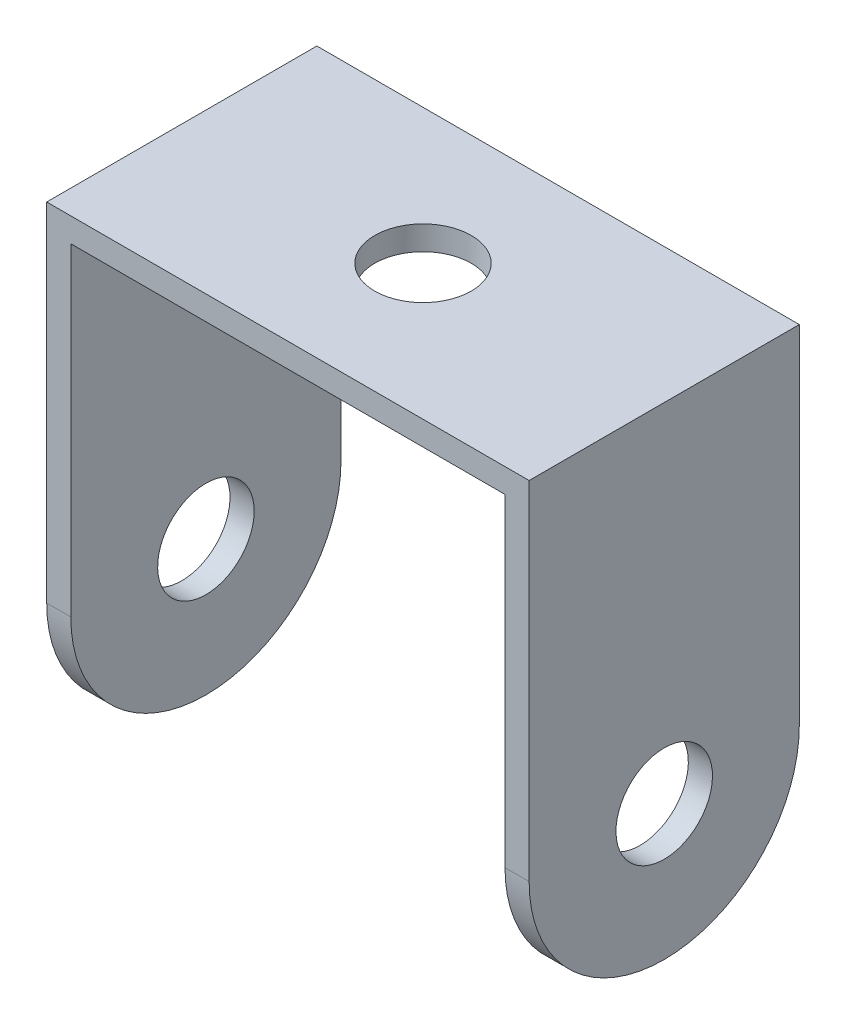
ISO-10303-21;
HEADER;
FILE_DESCRIPTION(('STEP AP214'),'2;1');
FILE_NAME('part.step','',(''),(''),'','','');
FILE_SCHEMA(('AUTOMOTIVE_DESIGN { 1 0 10303 214 1 1 1 1 }'));
ENDSEC;
DATA;
#1=APPLICATION_CONTEXT('core data for automotive mechanical design processes');
#2=APPLICATION_PROTOCOL_DEFINITION('international standard','automotive_design',2000,#1);
#3=PRODUCT_CONTEXT('',#1,'mechanical');
#4=PRODUCT('Part','Part','',(#3));
#5=PRODUCT_RELATED_PRODUCT_CATEGORY('part','',(#4));
#6=PRODUCT_DEFINITION_FORMATION('','',#4);
#7=PRODUCT_DEFINITION_CONTEXT('part definition',#1,'design');
#8=PRODUCT_DEFINITION('design','',#6,#7);
#9=PRODUCT_DEFINITION_SHAPE('','',#8);
#10=(LENGTH_UNIT() NAMED_UNIT(*) SI_UNIT(.MILLI.,.METRE.));
#11=(NAMED_UNIT(*) PLANE_ANGLE_UNIT() SI_UNIT($,.RADIAN.));
#12=(NAMED_UNIT(*) SI_UNIT($,.STERADIAN.) SOLID_ANGLE_UNIT());
#13=UNCERTAINTY_MEASURE_WITH_UNIT(LENGTH_MEASURE(1.E-05),#10,'distance_accuracy_value','');
#14=(GEOMETRIC_REPRESENTATION_CONTEXT(3) GLOBAL_UNCERTAINTY_ASSIGNED_CONTEXT((#13)) GLOBAL_UNIT_ASSIGNED_CONTEXT((#10,
#11,#12)) REPRESENTATION_CONTEXT('',''));
#15=CARTESIAN_POINT('',(0.,0.,0.));
#16=DIRECTION('',(0.,0.,1.));
#17=DIRECTION('',(1.,0.,0.));
#18=AXIS2_PLACEMENT_3D('',#15,#16,#17);
#19=CARTESIAN_POINT('',(0.,0.,28.));
#20=DIRECTION('',(0.,0.,1.));
#21=DIRECTION('',(1.,0.,0.));
#22=AXIS2_PLACEMENT_3D('',#19,#20,#21);
#23=PLANE('',#22);
#24=DIRECTION('',(0.,1.,0.));
#25=VECTOR('',#24,1.);
#26=CARTESIAN_POINT('',(22.5,0.,28.));
#27=LINE('',#26,#25);
#28=CARTESIAN_POINT('',(22.5,-11.,28.));
#29=VERTEX_POINT('',#28);
#30=CARTESIAN_POINT('',(22.5,22.5,28.));
#31=VERTEX_POINT('',#30);
#32=EDGE_CURVE('E132',#29,#31,#27,.T.);
#33=ORIENTED_EDGE('',*,*,#32,.F.);
#34=DIRECTION('',(1.,0.,0.));
#35=VECTOR('',#34,1.);
#36=CARTESIAN_POINT('',(25.,-11.,28.));
#37=LINE('',#36,#35);
#38=CARTESIAN_POINT('',(25.,-11.,28.));
#39=VERTEX_POINT('',#38);
#40=EDGE_CURVE('E201',#29,#39,#37,.T.);
#41=ORIENTED_EDGE('',*,*,#40,.T.);
#42=DIRECTION('',(0.,1.,0.));
#43=VECTOR('',#42,1.);
#44=CARTESIAN_POINT('',(25.,25.,28.));
#45=LINE('',#44,#43);
#46=CARTESIAN_POINT('',(25.,25.,28.));
#47=VERTEX_POINT('',#46);
#48=EDGE_CURVE('E165',#39,#47,#45,.T.);
#49=ORIENTED_EDGE('',*,*,#48,.T.);
#50=DIRECTION('',(-1.,0.,0.));
#51=VECTOR('',#50,1.);
#52=CARTESIAN_POINT('',(-25.,25.,28.));
#53=LINE('',#52,#51);
#54=CARTESIAN_POINT('',(-25.,25.,28.));
#55=VERTEX_POINT('',#54);
#56=EDGE_CURVE('E168',#47,#55,#53,.T.);
#57=ORIENTED_EDGE('',*,*,#56,.T.);
#58=DIRECTION('',(0.,-1.,0.));
#59=VECTOR('',#58,1.);
#60=CARTESIAN_POINT('',(-25.,25.,28.));
#61=LINE('',#60,#59);
#62=CARTESIAN_POINT('',(-25.,-11.,28.));
#63=VERTEX_POINT('',#62);
#64=EDGE_CURVE('E172',#55,#63,#61,.T.);
#65=ORIENTED_EDGE('',*,*,#64,.T.);
#66=DIRECTION('',(1.,0.,0.));
#67=VECTOR('',#66,1.);
#68=CARTESIAN_POINT('',(-22.5,-11.,28.));
#69=LINE('',#68,#67);
#70=CARTESIAN_POINT('',(-22.5,-11.,28.));
#71=VERTEX_POINT('',#70);
#72=EDGE_CURVE('E144',#63,#71,#69,.T.);
#73=ORIENTED_EDGE('',*,*,#72,.T.);
#74=DIRECTION('',(0.,-1.,0.));
#75=VECTOR('',#74,1.);
#76=CARTESIAN_POINT('',(-22.5,0.,28.));
#77=LINE('',#76,#75);
#78=CARTESIAN_POINT('',(-22.5,22.5,28.));
#79=VERTEX_POINT('',#78);
#80=EDGE_CURVE('E133',#79,#71,#77,.T.);
#81=ORIENTED_EDGE('',*,*,#80,.F.);
#82=DIRECTION('',(-1.,0.,0.));
#83=VECTOR('',#82,1.);
#84=CARTESIAN_POINT('',(0.,22.5,28.));
#85=LINE('',#84,#83);
#86=EDGE_CURVE('E120',#31,#79,#85,.T.);
#87=ORIENTED_EDGE('',*,*,#86,.F.);
#88=EDGE_LOOP('',(#33,#41,#49,#57,#65,#73,#81,#87));
#89=FACE_BOUND('',#88,.T.);
#90=ADVANCED_FACE('F39',(#89),#23,.T.);
#91=CARTESIAN_POINT('',(0.,0.,0.));
#92=DIRECTION('',(0.,0.,1.));
#93=DIRECTION('',(1.,0.,0.));
#94=AXIS2_PLACEMENT_3D('',#91,#92,#93);
#95=PLANE('',#94);
#96=DIRECTION('',(0.,-1.,0.));
#97=VECTOR('',#96,1.);
#98=CARTESIAN_POINT('',(-22.5,0.,0.));
#99=LINE('',#98,#97);
#100=CARTESIAN_POINT('',(-22.5,22.5,0.));
#101=VERTEX_POINT('',#100);
#102=CARTESIAN_POINT('',(-22.5,-11.,0.));
#103=VERTEX_POINT('',#102);
#104=EDGE_CURVE('E138',#101,#103,#99,.T.);
#105=ORIENTED_EDGE('',*,*,#104,.T.);
#106=DIRECTION('',(1.,0.,0.));
#107=VECTOR('',#106,1.);
#108=CARTESIAN_POINT('',(0.,-11.,0.));
#109=LINE('',#108,#107);
#110=CARTESIAN_POINT('',(-25.,-11.,0.));
#111=VERTEX_POINT('',#110);
#112=EDGE_CURVE('E11',#103,#111,#109,.F.);
#113=ORIENTED_EDGE('',*,*,#112,.T.);
#114=DIRECTION('',(0.,-1.,0.));
#115=VECTOR('',#114,1.);
#116=CARTESIAN_POINT('',(-25.,25.,0.));
#117=LINE('',#116,#115);
#118=CARTESIAN_POINT('',(-25.,25.,0.));
#119=VERTEX_POINT('',#118);
#120=EDGE_CURVE('E169',#119,#111,#117,.T.);
#121=ORIENTED_EDGE('',*,*,#120,.F.);
#122=DIRECTION('',(-1.,0.,0.));
#123=VECTOR('',#122,1.);
#124=CARTESIAN_POINT('',(-25.,25.,0.));
#125=LINE('',#124,#123);
#126=CARTESIAN_POINT('',(25.,25.,0.));
#127=VERTEX_POINT('',#126);
#128=EDGE_CURVE('E178',#127,#119,#125,.T.);
#129=ORIENTED_EDGE('',*,*,#128,.F.);
#130=DIRECTION('',(0.,1.,0.));
#131=VECTOR('',#130,1.);
#132=CARTESIAN_POINT('',(25.,25.,0.));
#133=LINE('',#132,#131);
#134=CARTESIAN_POINT('',(25.,-11.,0.));
#135=VERTEX_POINT('',#134);
#136=EDGE_CURVE('E163',#135,#127,#133,.T.);
#137=ORIENTED_EDGE('',*,*,#136,.F.);
#138=DIRECTION('',(1.,0.,0.));
#139=VECTOR('',#138,1.);
#140=CARTESIAN_POINT('',(0.,-11.,0.));
#141=LINE('',#140,#139);
#142=CARTESIAN_POINT('',(22.5,-11.,0.));
#143=VERTEX_POINT('',#142);
#144=EDGE_CURVE('E49',#135,#143,#141,.F.);
#145=ORIENTED_EDGE('',*,*,#144,.T.);
#146=DIRECTION('',(0.,1.,0.));
#147=VECTOR('',#146,1.);
#148=CARTESIAN_POINT('',(22.5,0.,0.));
#149=LINE('',#148,#147);
#150=CARTESIAN_POINT('',(22.5,22.5,0.));
#151=VERTEX_POINT('',#150);
#152=EDGE_CURVE('E146',#143,#151,#149,.T.);
#153=ORIENTED_EDGE('',*,*,#152,.T.);
#154=DIRECTION('',(-1.,0.,0.));
#155=VECTOR('',#154,1.);
#156=CARTESIAN_POINT('',(0.,22.5,0.));
#157=LINE('',#156,#155);
#158=EDGE_CURVE('E149',#151,#101,#157,.T.);
#159=ORIENTED_EDGE('',*,*,#158,.T.);
#160=EDGE_LOOP('',(#105,#113,#121,#129,#137,#145,#153,#159));
#161=FACE_BOUND('',#160,.T.);
#162=ADVANCED_FACE('F246',(#161),#95,.F.);
#163=CARTESIAN_POINT('',(25.,25.,28.));
#164=DIRECTION('',(-1.,0.,0.));
#165=DIRECTION('',(0.,-1.,0.));
#166=AXIS2_PLACEMENT_3D('',#163,#164,#165);
#167=PLANE('',#166);
#168=CARTESIAN_POINT('',(25.,-11.,14.));
#169=DIRECTION('',(1.,0.,0.));
#170=DIRECTION('',(0.,1.,0.));
#171=AXIS2_PLACEMENT_3D('',#168,#169,#170);
#172=CIRCLE('',#171,5.);
#173=CARTESIAN_POINT('',(25.,-5.99999999999999,14.));
#174=VERTEX_POINT('',#173);
#175=EDGE_CURVE('E232',#174,#174,#172,.T.);
#176=ORIENTED_EDGE('',*,*,#175,.F.);
#177=EDGE_LOOP('',(#176));
#178=FACE_BOUND('',#177,.T.);
#179=ORIENTED_EDGE('',*,*,#48,.F.);
#180=CARTESIAN_POINT('',(25.,-11.,14.));
#181=DIRECTION('',(-1.,0.,0.));
#182=DIRECTION('',(0.,-1.,0.));
#183=AXIS2_PLACEMENT_3D('',#180,#181,#182);
#184=CIRCLE('',#183,14.);
#185=CARTESIAN_POINT('',(25.,-25.,14.));
#186=VERTEX_POINT('',#185);
#187=EDGE_CURVE('E208',#39,#186,#184,.F.);
#188=ORIENTED_EDGE('',*,*,#187,.T.);
#189=CARTESIAN_POINT('',(25.,-11.,14.));
#190=DIRECTION('',(-1.,0.,0.));
#191=DIRECTION('',(0.,-1.,0.));
#192=AXIS2_PLACEMENT_3D('',#189,#190,#191);
#193=CIRCLE('',#192,14.);
#194=EDGE_CURVE('E205',#186,#135,#193,.F.);
#195=ORIENTED_EDGE('',*,*,#194,.T.);
#196=ORIENTED_EDGE('',*,*,#136,.T.);
#197=DIRECTION('',(0.,0.,-1.));
#198=VECTOR('',#197,1.);
#199=CARTESIAN_POINT('',(25.,25.,28.));
#200=LINE('',#199,#198);
#201=EDGE_CURVE('E186',#47,#127,#200,.T.);
#202=ORIENTED_EDGE('',*,*,#201,.F.);
#203=EDGE_LOOP('',(#179,#188,#195,#196,#202));
#204=FACE_BOUND('',#203,.T.);
#205=ADVANCED_FACE('F258',(#178,#204),#167,.F.);
#206=CARTESIAN_POINT('',(-25.,25.,28.));
#207=DIRECTION('',(0.,-1.,0.));
#208=DIRECTION('',(0.,0.,-1.));
#209=AXIS2_PLACEMENT_3D('',#206,#207,#208);
#210=PLANE('',#209);
#211=CARTESIAN_POINT('',(0.,25.,14.));
#212=DIRECTION('',(0.,1.,0.));
#213=DIRECTION('',(0.,0.,1.));
#214=AXIS2_PLACEMENT_3D('',#211,#212,#213);
#215=CIRCLE('',#214,5.);
#216=CARTESIAN_POINT('',(0.,25.,19.));
#217=VERTEX_POINT('',#216);
#218=EDGE_CURVE('E152',#217,#217,#215,.T.);
#219=ORIENTED_EDGE('',*,*,#218,.F.);
#220=EDGE_LOOP('',(#219));
#221=FACE_BOUND('',#220,.T.);
#222=ORIENTED_EDGE('',*,*,#128,.T.);
#223=DIRECTION('',(0.,0.,-1.));
#224=VECTOR('',#223,1.);
#225=CARTESIAN_POINT('',(-25.,25.,28.));
#226=LINE('',#225,#224);
#227=EDGE_CURVE('E175',#55,#119,#226,.T.);
#228=ORIENTED_EDGE('',*,*,#227,.F.);
#229=ORIENTED_EDGE('',*,*,#56,.F.);
#230=ORIENTED_EDGE('',*,*,#201,.T.);
#231=EDGE_LOOP('',(#222,#228,#229,#230));
#232=FACE_BOUND('',#231,.T.);
#233=ADVANCED_FACE('F285',(#221,#232),#210,.F.);
#234=CARTESIAN_POINT('',(-25.,25.,28.));
#235=DIRECTION('',(1.,0.,0.));
#236=DIRECTION('',(0.,1.,0.));
#237=AXIS2_PLACEMENT_3D('',#234,#235,#236);
#238=PLANE('',#237);
#239=CARTESIAN_POINT('',(-25.,-11.,14.));
#240=DIRECTION('',(1.,0.,0.));
#241=DIRECTION('',(0.,1.,0.));
#242=AXIS2_PLACEMENT_3D('',#239,#240,#241);
#243=CIRCLE('',#242,5.);
#244=CARTESIAN_POINT('',(-25.,-6.,14.));
#245=VERTEX_POINT('',#244);
#246=EDGE_CURVE('E198',#245,#245,#243,.T.);
#247=ORIENTED_EDGE('',*,*,#246,.T.);
#248=EDGE_LOOP('',(#247));
#249=FACE_BOUND('',#248,.T.);
#250=CARTESIAN_POINT('',(-25.,-11.,14.));
#251=DIRECTION('',(1.,0.,0.));
#252=DIRECTION('',(0.,1.,0.));
#253=AXIS2_PLACEMENT_3D('',#250,#251,#252);
#254=CIRCLE('',#253,14.);
#255=CARTESIAN_POINT('',(-25.,-25.,14.));
#256=VERTEX_POINT('',#255);
#257=EDGE_CURVE('E57',#111,#256,#254,.F.);
#258=ORIENTED_EDGE('',*,*,#257,.T.);
#259=CARTESIAN_POINT('',(-25.,-11.,14.));
#260=DIRECTION('',(1.,0.,0.));
#261=DIRECTION('',(0.,1.,0.));
#262=AXIS2_PLACEMENT_3D('',#259,#260,#261);
#263=CIRCLE('',#262,14.);
#264=EDGE_CURVE('E225',#256,#63,#263,.F.);
#265=ORIENTED_EDGE('',*,*,#264,.T.);
#266=ORIENTED_EDGE('',*,*,#64,.F.);
#267=ORIENTED_EDGE('',*,*,#227,.T.);
#268=ORIENTED_EDGE('',*,*,#120,.T.);
#269=EDGE_LOOP('',(#258,#265,#266,#267,#268));
#270=FACE_BOUND('',#269,.T.);
#271=ADVANCED_FACE('F282',(#249,#270),#238,.F.);
#272=CARTESIAN_POINT('',(-22.5,0.,28.));
#273=DIRECTION('',(1.,0.,0.));
#274=DIRECTION('',(0.,0.,-1.));
#275=AXIS2_PLACEMENT_3D('',#272,#273,#274);
#276=PLANE('',#275);
#277=CARTESIAN_POINT('',(-22.5,-11.,14.));
#278=DIRECTION('',(1.,0.,0.));
#279=DIRECTION('',(0.,0.,-1.));
#280=AXIS2_PLACEMENT_3D('',#277,#278,#279);
#281=CIRCLE('',#280,5.);
#282=CARTESIAN_POINT('',(-22.5,-11.,9.));
#283=VERTEX_POINT('',#282);
#284=EDGE_CURVE('E197',#283,#283,#281,.T.);
#285=ORIENTED_EDGE('',*,*,#284,.F.);
#286=EDGE_LOOP('',(#285));
#287=FACE_BOUND('',#286,.T.);
#288=ORIENTED_EDGE('',*,*,#80,.T.);
#289=CARTESIAN_POINT('',(-22.5,-11.,14.));
#290=DIRECTION('',(1.,0.,0.));
#291=DIRECTION('',(0.,0.,-1.));
#292=AXIS2_PLACEMENT_3D('',#289,#290,#291);
#293=CIRCLE('',#292,14.);
#294=CARTESIAN_POINT('',(-22.5,-25.,14.));
#295=VERTEX_POINT('',#294);
#296=EDGE_CURVE('E220',#71,#295,#293,.T.);
#297=ORIENTED_EDGE('',*,*,#296,.T.);
#298=CARTESIAN_POINT('',(-22.5,-11.,14.));
#299=DIRECTION('',(1.,0.,0.));
#300=DIRECTION('',(0.,0.,-1.));
#301=AXIS2_PLACEMENT_3D('',#298,#299,#300);
#302=CIRCLE('',#301,14.);
#303=EDGE_CURVE('E217',#295,#103,#302,.T.);
#304=ORIENTED_EDGE('',*,*,#303,.T.);
#305=ORIENTED_EDGE('',*,*,#104,.F.);
#306=DIRECTION('',(0.,0.,-1.));
#307=VECTOR('',#306,1.);
#308=CARTESIAN_POINT('',(-22.5,22.5,28.));
#309=LINE('',#308,#307);
#310=EDGE_CURVE('E124',#79,#101,#309,.T.);
#311=ORIENTED_EDGE('',*,*,#310,.F.);
#312=EDGE_LOOP('',(#288,#297,#304,#305,#311));
#313=FACE_BOUND('',#312,.T.);
#314=ADVANCED_FACE('F137',(#287,#313),#276,.T.);
#315=CARTESIAN_POINT('',(22.5,0.,28.));
#316=DIRECTION('',(-1.,0.,0.));
#317=DIRECTION('',(0.,0.,1.));
#318=AXIS2_PLACEMENT_3D('',#315,#316,#317);
#319=PLANE('',#318);
#320=CARTESIAN_POINT('',(22.5,-11.,14.));
#321=DIRECTION('',(-1.,0.,0.));
#322=DIRECTION('',(0.,0.,1.));
#323=AXIS2_PLACEMENT_3D('',#320,#321,#322);
#324=CIRCLE('',#323,5.);
#325=CARTESIAN_POINT('',(22.5,-11.,19.));
#326=VERTEX_POINT('',#325);
#327=EDGE_CURVE('E193',#326,#326,#324,.T.);
#328=ORIENTED_EDGE('',*,*,#327,.F.);
#329=EDGE_LOOP('',(#328));
#330=FACE_BOUND('',#329,.T.);
#331=CARTESIAN_POINT('',(22.5,-11.,14.));
#332=DIRECTION('',(-1.,0.,0.));
#333=DIRECTION('',(0.,0.,1.));
#334=AXIS2_PLACEMENT_3D('',#331,#332,#333);
#335=CIRCLE('',#334,14.);
#336=CARTESIAN_POINT('',(22.5,-25.,14.));
#337=VERTEX_POINT('',#336);
#338=EDGE_CURVE('E211',#143,#337,#335,.T.);
#339=ORIENTED_EDGE('',*,*,#338,.T.);
#340=CARTESIAN_POINT('',(22.5,-11.,14.));
#341=DIRECTION('',(-1.,0.,0.));
#342=DIRECTION('',(0.,0.,1.));
#343=AXIS2_PLACEMENT_3D('',#340,#341,#342);
#344=CIRCLE('',#343,14.);
#345=EDGE_CURVE('E214',#337,#29,#344,.T.);
#346=ORIENTED_EDGE('',*,*,#345,.T.);
#347=ORIENTED_EDGE('',*,*,#32,.T.);
#348=DIRECTION('',(0.,0.,-1.));
#349=VECTOR('',#348,1.);
#350=CARTESIAN_POINT('',(22.5,22.5,28.));
#351=LINE('',#350,#349);
#352=EDGE_CURVE('E127',#31,#151,#351,.T.);
#353=ORIENTED_EDGE('',*,*,#352,.T.);
#354=ORIENTED_EDGE('',*,*,#152,.F.);
#355=EDGE_LOOP('',(#339,#346,#347,#353,#354));
#356=FACE_BOUND('',#355,.T.);
#357=ADVANCED_FACE('F252',(#330,#356),#319,.T.);
#358=CARTESIAN_POINT('',(0.,22.5,28.));
#359=DIRECTION('',(0.,-1.,0.));
#360=DIRECTION('',(0.,0.,-1.));
#361=AXIS2_PLACEMENT_3D('',#358,#359,#360);
#362=PLANE('',#361);
#363=CARTESIAN_POINT('',(0.,22.5,14.));
#364=DIRECTION('',(0.,-1.,0.));
#365=DIRECTION('',(0.,0.,-1.));
#366=AXIS2_PLACEMENT_3D('',#363,#364,#365);
#367=CIRCLE('',#366,5.);
#368=CARTESIAN_POINT('',(0.,22.5,9.));
#369=VERTEX_POINT('',#368);
#370=EDGE_CURVE('E159',#369,#369,#367,.T.);
#371=ORIENTED_EDGE('',*,*,#370,.F.);
#372=EDGE_LOOP('',(#371));
#373=FACE_BOUND('',#372,.T.);
#374=ORIENTED_EDGE('',*,*,#158,.F.);
#375=ORIENTED_EDGE('',*,*,#352,.F.);
#376=ORIENTED_EDGE('',*,*,#86,.T.);
#377=ORIENTED_EDGE('',*,*,#310,.T.);
#378=EDGE_LOOP('',(#374,#375,#376,#377));
#379=FACE_BOUND('',#378,.T.);
#380=ADVANCED_FACE('F123',(#373,#379),#362,.T.);
#381=CARTESIAN_POINT('',(0.,-25.,14.));
#382=DIRECTION('',(0.,1.,0.));
#383=DIRECTION('',(0.,0.,1.));
#384=AXIS2_PLACEMENT_3D('',#381,#382,#383);
#385=CYLINDRICAL_SURFACE('',#384,5.);
#386=ORIENTED_EDGE('',*,*,#370,.T.);
#387=EDGE_LOOP('',(#386));
#388=FACE_BOUND('',#387,.T.);
#389=ORIENTED_EDGE('',*,*,#218,.T.);
#390=EDGE_LOOP('',(#389));
#391=FACE_BOUND('',#390,.T.);
#392=ADVANCED_FACE('F297',(#388,#391),#385,.F.);
#393=CARTESIAN_POINT('',(-25.,-11.,14.));
#394=DIRECTION('',(1.,0.,0.));
#395=DIRECTION('',(0.,1.,0.));
#396=AXIS2_PLACEMENT_3D('',#393,#394,#395);
#397=CYLINDRICAL_SURFACE('',#396,5.);
#398=ORIENTED_EDGE('',*,*,#327,.T.);
#399=EDGE_LOOP('',(#398));
#400=FACE_BOUND('',#399,.T.);
#401=ORIENTED_EDGE('',*,*,#175,.T.);
#402=EDGE_LOOP('',(#401));
#403=FACE_BOUND('',#402,.T.);
#404=ADVANCED_FACE('F270',(#400,#403),#397,.F.);
#405=ORIENTED_EDGE('',*,*,#284,.T.);
#406=EDGE_LOOP('',(#405));
#407=FACE_BOUND('',#406,.T.);
#408=ORIENTED_EDGE('',*,*,#246,.F.);
#409=EDGE_LOOP('',(#408));
#410=FACE_BOUND('',#409,.T.);
#411=ADVANCED_FACE('F263',(#407,#410),#397,.F.);
#412=CARTESIAN_POINT('',(-25.,-11.,14.));
#413=DIRECTION('',(1.,0.,0.));
#414=DIRECTION('',(0.,0.,-1.));
#415=AXIS2_PLACEMENT_3D('',#412,#413,#414);
#416=CYLINDRICAL_SURFACE('',#415,14.);
#417=DIRECTION('',(1.,0.,0.));
#418=VECTOR('',#417,1.);
#419=CARTESIAN_POINT('',(-25.,-25.,14.));
#420=LINE('',#419,#418);
#421=EDGE_CURVE('E229',#337,#186,#420,.T.);
#422=ORIENTED_EDGE('',*,*,#421,.F.);
#423=ORIENTED_EDGE('',*,*,#338,.F.);
#424=ORIENTED_EDGE('',*,*,#144,.F.);
#425=ORIENTED_EDGE('',*,*,#194,.F.);
#426=EDGE_LOOP('',(#422,#423,#424,#425));
#427=FACE_BOUND('',#426,.T.);
#428=ADVANCED_FACE('F261',(#427),#416,.T.);
#429=CARTESIAN_POINT('',(0.,-11.,14.));
#430=DIRECTION('',(-1.,0.,0.));
#431=DIRECTION('',(0.,0.,1.));
#432=AXIS2_PLACEMENT_3D('',#429,#430,#431);
#433=CYLINDRICAL_SURFACE('',#432,14.);
#434=ORIENTED_EDGE('',*,*,#345,.F.);
#435=ORIENTED_EDGE('',*,*,#421,.T.);
#436=ORIENTED_EDGE('',*,*,#187,.F.);
#437=ORIENTED_EDGE('',*,*,#40,.F.);
#438=EDGE_LOOP('',(#434,#435,#436,#437));
#439=FACE_BOUND('',#438,.T.);
#440=ADVANCED_FACE('F255',(#439),#433,.T.);
#441=CARTESIAN_POINT('',(-25.,-11.,14.));
#442=DIRECTION('',(1.,0.,0.));
#443=DIRECTION('',(0.,0.,-1.));
#444=AXIS2_PLACEMENT_3D('',#441,#442,#443);
#445=CYLINDRICAL_SURFACE('',#444,14.);
#446=DIRECTION('',(1.,0.,0.));
#447=VECTOR('',#446,1.);
#448=CARTESIAN_POINT('',(-25.,-25.,14.));
#449=LINE('',#448,#447);
#450=EDGE_CURVE('E43',#256,#295,#449,.T.);
#451=ORIENTED_EDGE('',*,*,#450,.F.);
#452=ORIENTED_EDGE('',*,*,#257,.F.);
#453=ORIENTED_EDGE('',*,*,#112,.F.);
#454=ORIENTED_EDGE('',*,*,#303,.F.);
#455=EDGE_LOOP('',(#451,#452,#453,#454));
#456=FACE_BOUND('',#455,.T.);
#457=ADVANCED_FACE('F41',(#456),#445,.T.);
#458=CARTESIAN_POINT('',(0.,-11.,14.));
#459=DIRECTION('',(-1.,0.,0.));
#460=DIRECTION('',(0.,0.,1.));
#461=AXIS2_PLACEMENT_3D('',#458,#459,#460);
#462=CYLINDRICAL_SURFACE('',#461,14.);
#463=ORIENTED_EDGE('',*,*,#264,.F.);
#464=ORIENTED_EDGE('',*,*,#450,.T.);
#465=ORIENTED_EDGE('',*,*,#296,.F.);
#466=ORIENTED_EDGE('',*,*,#72,.F.);
#467=EDGE_LOOP('',(#463,#464,#465,#466));
#468=FACE_BOUND('',#467,.T.);
#469=ADVANCED_FACE('F243',(#468),#462,.T.);
#470=CLOSED_SHELL('',(#90,#162,#205,#233,#271,#314,#357,#380,#392,#404,#411,#428,#440,#457,#469));
#471=MANIFOLD_SOLID_BREP('B2',#470);
#472=ADVANCED_BREP_SHAPE_REPRESENTATION('',(#18,#471),#14);
#473=SHAPE_DEFINITION_REPRESENTATION(#9,#472);
ENDSEC;
END-ISO-10303-21;
